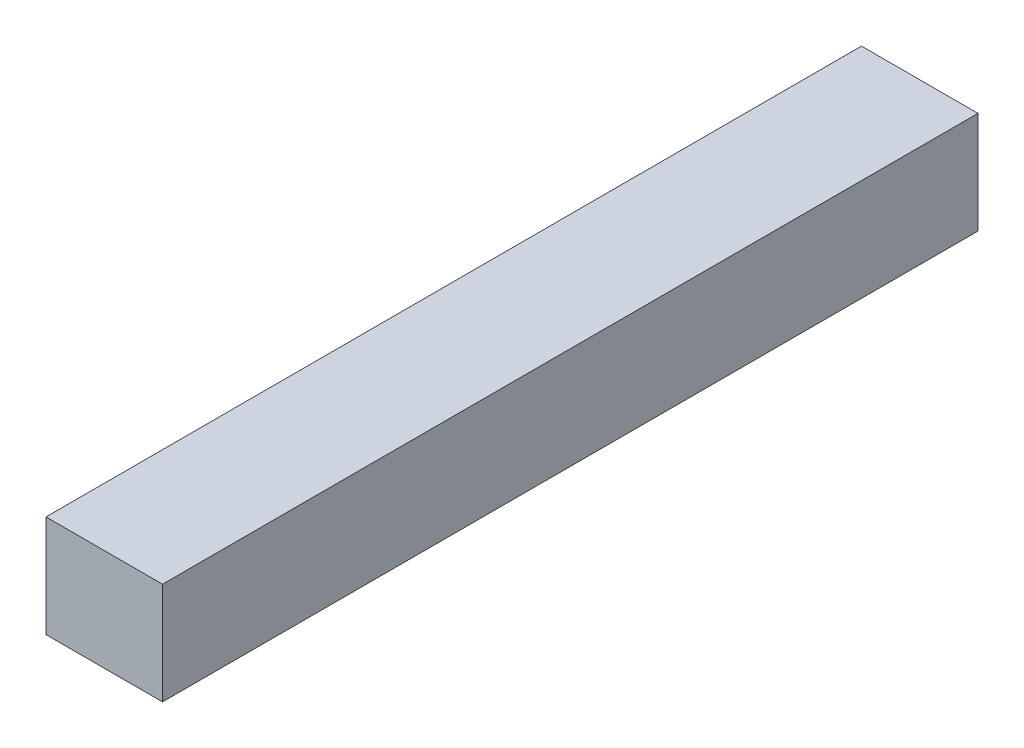
ISO-10303-21;
HEADER;
FILE_DESCRIPTION(('STEP AP214'),'2;1');
FILE_NAME('part.step','',(''),(''),'','','');
FILE_SCHEMA(('AUTOMOTIVE_DESIGN { 1 0 10303 214 1 1 1 1 }'));
ENDSEC;
DATA;
#1=APPLICATION_CONTEXT('core data for automotive mechanical design processes');
#2=APPLICATION_PROTOCOL_DEFINITION('international standard','automotive_design',2000,#1);
#3=PRODUCT_CONTEXT('',#1,'mechanical');
#4=PRODUCT('Part','Part','',(#3));
#5=PRODUCT_RELATED_PRODUCT_CATEGORY('part','',(#4));
#6=PRODUCT_DEFINITION_FORMATION('','',#4);
#7=PRODUCT_DEFINITION_CONTEXT('part definition',#1,'design');
#8=PRODUCT_DEFINITION('design','',#6,#7);
#9=PRODUCT_DEFINITION_SHAPE('','',#8);
#10=(LENGTH_UNIT() NAMED_UNIT(*) SI_UNIT(.MILLI.,.METRE.));
#11=(NAMED_UNIT(*) PLANE_ANGLE_UNIT() SI_UNIT($,.RADIAN.));
#12=(NAMED_UNIT(*) SI_UNIT($,.STERADIAN.) SOLID_ANGLE_UNIT());
#13=UNCERTAINTY_MEASURE_WITH_UNIT(LENGTH_MEASURE(1.E-05),#10,'distance_accuracy_value','');
#14=(GEOMETRIC_REPRESENTATION_CONTEXT(3) GLOBAL_UNCERTAINTY_ASSIGNED_CONTEXT((#13)) GLOBAL_UNIT_ASSIGNED_CONTEXT((#10,
#11,#12)) REPRESENTATION_CONTEXT('',''));
#15=CARTESIAN_POINT('',(0.,0.,0.));
#16=DIRECTION('',(0.,0.,1.));
#17=DIRECTION('',(1.,0.,0.));
#18=AXIS2_PLACEMENT_3D('',#15,#16,#17);
#19=CARTESIAN_POINT('',(4.,-3.5,28.));
#20=DIRECTION('',(-1.,0.,0.));
#21=DIRECTION('',(0.,0.,1.));
#22=AXIS2_PLACEMENT_3D('',#19,#20,#21);
#23=PLANE('',#22);
#24=DIRECTION('',(0.,1.,0.));
#25=VECTOR('',#24,1.);
#26=CARTESIAN_POINT('',(4.,-3.5,-28.));
#27=LINE('',#26,#25);
#28=CARTESIAN_POINT('',(4.,-3.5,-28.));
#29=VERTEX_POINT('',#28);
#30=CARTESIAN_POINT('',(4.,3.5,-28.));
#31=VERTEX_POINT('',#30);
#32=EDGE_CURVE('E99',#29,#31,#27,.T.);
#33=ORIENTED_EDGE('',*,*,#32,.T.);
#34=DIRECTION('',(0.,0.,-1.));
#35=VECTOR('',#34,1.);
#36=CARTESIAN_POINT('',(4.,3.5,28.));
#37=LINE('',#36,#35);
#38=CARTESIAN_POINT('',(4.,3.5,28.));
#39=VERTEX_POINT('',#38);
#40=EDGE_CURVE('E11',#39,#31,#37,.T.);
#41=ORIENTED_EDGE('',*,*,#40,.F.);
#42=DIRECTION('',(0.,1.,0.));
#43=VECTOR('',#42,1.);
#44=CARTESIAN_POINT('',(4.,-3.5,28.));
#45=LINE('',#44,#43);
#46=CARTESIAN_POINT('',(4.,-3.5,28.));
#47=VERTEX_POINT('',#46);
#48=EDGE_CURVE('E87',#47,#39,#45,.T.);
#49=ORIENTED_EDGE('',*,*,#48,.F.);
#50=DIRECTION('',(0.,0.,-1.));
#51=VECTOR('',#50,1.);
#52=CARTESIAN_POINT('',(4.,-3.5,28.));
#53=LINE('',#52,#51);
#54=EDGE_CURVE('E95',#47,#29,#53,.T.);
#55=ORIENTED_EDGE('',*,*,#54,.T.);
#56=EDGE_LOOP('',(#33,#41,#49,#55));
#57=FACE_BOUND('',#56,.T.);
#58=ADVANCED_FACE('F36',(#57),#23,.F.);
#59=CARTESIAN_POINT('',(-4.,3.5,28.));
#60=DIRECTION('',(0.,-1.,0.));
#61=DIRECTION('',(0.,0.,-1.));
#62=AXIS2_PLACEMENT_3D('',#59,#60,#61);
#63=PLANE('',#62);
#64=DIRECTION('',(-1.,0.,0.));
#65=VECTOR('',#64,1.);
#66=CARTESIAN_POINT('',(-4.,3.5,-28.));
#67=LINE('',#66,#65);
#68=CARTESIAN_POINT('',(-4.,3.5,-28.));
#69=VERTEX_POINT('',#68);
#70=EDGE_CURVE('E91',#31,#69,#67,.T.);
#71=ORIENTED_EDGE('',*,*,#70,.T.);
#72=DIRECTION('',(0.,0.,-1.));
#73=VECTOR('',#72,1.);
#74=CARTESIAN_POINT('',(-4.,3.5,28.));
#75=LINE('',#74,#73);
#76=CARTESIAN_POINT('',(-4.,3.5,28.));
#77=VERTEX_POINT('',#76);
#78=EDGE_CURVE('E44',#77,#69,#75,.T.);
#79=ORIENTED_EDGE('',*,*,#78,.F.);
#80=DIRECTION('',(-1.,0.,0.));
#81=VECTOR('',#80,1.);
#82=CARTESIAN_POINT('',(-4.,3.5,28.));
#83=LINE('',#82,#81);
#84=EDGE_CURVE('E82',#39,#77,#83,.T.);
#85=ORIENTED_EDGE('',*,*,#84,.F.);
#86=ORIENTED_EDGE('',*,*,#40,.T.);
#87=EDGE_LOOP('',(#71,#79,#85,#86));
#88=FACE_BOUND('',#87,.T.);
#89=ADVANCED_FACE('F90',(#88),#63,.F.);
#90=CARTESIAN_POINT('',(-4.,-3.5,28.));
#91=DIRECTION('',(1.,0.,0.));
#92=DIRECTION('',(0.,0.,-1.));
#93=AXIS2_PLACEMENT_3D('',#90,#91,#92);
#94=PLANE('',#93);
#95=DIRECTION('',(0.,-1.,0.));
#96=VECTOR('',#95,1.);
#97=CARTESIAN_POINT('',(-4.,-3.5,-28.));
#98=LINE('',#97,#96);
#99=CARTESIAN_POINT('',(-4.,-3.5,-28.));
#100=VERTEX_POINT('',#99);
#101=EDGE_CURVE('E69',#69,#100,#98,.T.);
#102=ORIENTED_EDGE('',*,*,#101,.T.);
#103=DIRECTION('',(0.,0.,-1.));
#104=VECTOR('',#103,1.);
#105=CARTESIAN_POINT('',(-4.,-3.5,28.));
#106=LINE('',#105,#104);
#107=CARTESIAN_POINT('',(-4.,-3.5,28.));
#108=VERTEX_POINT('',#107);
#109=EDGE_CURVE('E92',#108,#100,#106,.T.);
#110=ORIENTED_EDGE('',*,*,#109,.F.);
#111=DIRECTION('',(0.,-1.,0.));
#112=VECTOR('',#111,1.);
#113=CARTESIAN_POINT('',(-4.,-3.5,28.));
#114=LINE('',#113,#112);
#115=EDGE_CURVE('E85',#77,#108,#114,.T.);
#116=ORIENTED_EDGE('',*,*,#115,.F.);
#117=ORIENTED_EDGE('',*,*,#78,.T.);
#118=EDGE_LOOP('',(#102,#110,#116,#117));
#119=FACE_BOUND('',#118,.T.);
#120=ADVANCED_FACE('F93',(#119),#94,.F.);
#121=CARTESIAN_POINT('',(-4.,-3.5,28.));
#122=DIRECTION('',(0.,1.,0.));
#123=DIRECTION('',(0.,0.,1.));
#124=AXIS2_PLACEMENT_3D('',#121,#122,#123);
#125=PLANE('',#124);
#126=DIRECTION('',(1.,0.,0.));
#127=VECTOR('',#126,1.);
#128=CARTESIAN_POINT('',(-4.,-3.5,-28.));
#129=LINE('',#128,#127);
#130=EDGE_CURVE('E75',#100,#29,#129,.T.);
#131=ORIENTED_EDGE('',*,*,#130,.T.);
#132=ORIENTED_EDGE('',*,*,#54,.F.);
#133=DIRECTION('',(1.,0.,0.));
#134=VECTOR('',#133,1.);
#135=CARTESIAN_POINT('',(-4.,-3.5,28.));
#136=LINE('',#135,#134);
#137=EDGE_CURVE('E52',#108,#47,#136,.T.);
#138=ORIENTED_EDGE('',*,*,#137,.F.);
#139=ORIENTED_EDGE('',*,*,#109,.T.);
#140=EDGE_LOOP('',(#131,#132,#138,#139));
#141=FACE_BOUND('',#140,.T.);
#142=ADVANCED_FACE('F106',(#141),#125,.F.);
#143=CARTESIAN_POINT('',(0.,0.,28.));
#144=DIRECTION('',(0.,0.,-1.));
#145=DIRECTION('',(-1.,0.,0.));
#146=AXIS2_PLACEMENT_3D('',#143,#144,#145);
#147=PLANE('',#146);
#148=ORIENTED_EDGE('',*,*,#48,.T.);
#149=ORIENTED_EDGE('',*,*,#84,.T.);
#150=ORIENTED_EDGE('',*,*,#115,.T.);
#151=ORIENTED_EDGE('',*,*,#137,.T.);
#152=EDGE_LOOP('',(#148,#149,#150,#151));
#153=FACE_BOUND('',#152,.T.);
#154=ADVANCED_FACE('F83',(#153),#147,.F.);
#155=CARTESIAN_POINT('',(0.,0.,-28.));
#156=DIRECTION('',(0.,0.,-1.));
#157=DIRECTION('',(-1.,0.,0.));
#158=AXIS2_PLACEMENT_3D('',#155,#156,#157);
#159=PLANE('',#158);
#160=ORIENTED_EDGE('',*,*,#32,.F.);
#161=ORIENTED_EDGE('',*,*,#130,.F.);
#162=ORIENTED_EDGE('',*,*,#101,.F.);
#163=ORIENTED_EDGE('',*,*,#70,.F.);
#164=EDGE_LOOP('',(#160,#161,#162,#163));
#165=FACE_BOUND('',#164,.T.);
#166=ADVANCED_FACE('F109',(#165),#159,.T.);
#167=CLOSED_SHELL('',(#58,#89,#120,#142,#154,#166));
#168=MANIFOLD_SOLID_BREP('B2',#167);
#169=ADVANCED_BREP_SHAPE_REPRESENTATION('',(#18,#168),#14);
#170=SHAPE_DEFINITION_REPRESENTATION(#9,#169);
ENDSEC;
END-ISO-10303-21;
